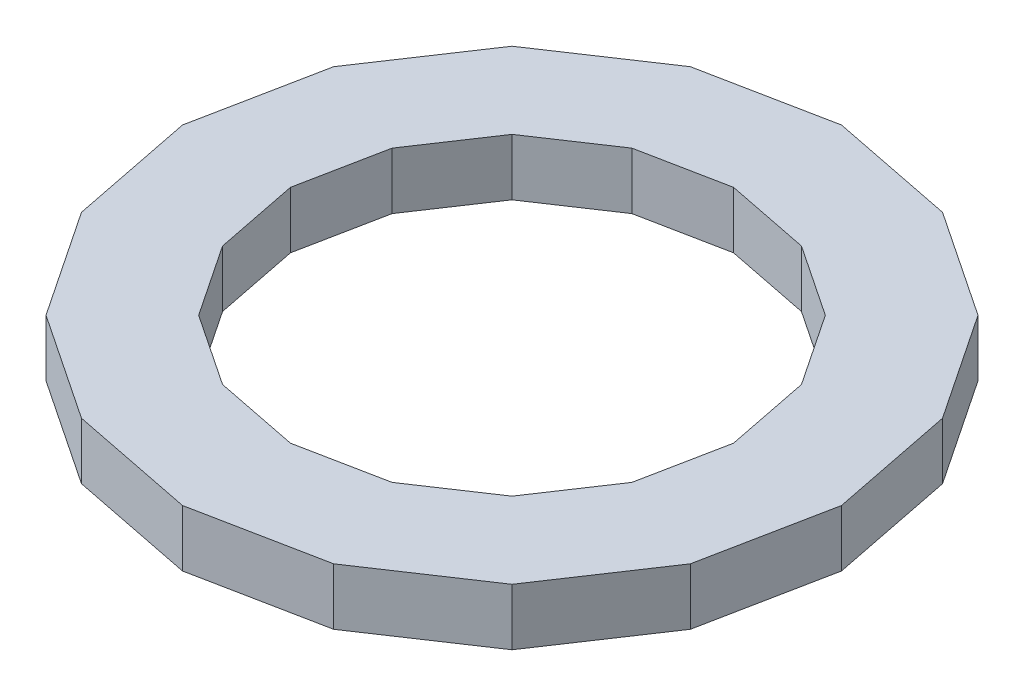
ISO-10303-21;
HEADER;
FILE_DESCRIPTION(('STEP AP214'),'2;1');
FILE_NAME('part.step','',(''),(''),'','','');
FILE_SCHEMA(('AUTOMOTIVE_DESIGN { 1 0 10303 214 1 1 1 1 }'));
ENDSEC;
DATA;
#1=APPLICATION_CONTEXT('core data for automotive mechanical design processes');
#2=APPLICATION_PROTOCOL_DEFINITION('international standard','automotive_design',2000,#1);
#3=PRODUCT_CONTEXT('',#1,'mechanical');
#4=PRODUCT('Part','Part','',(#3));
#5=PRODUCT_RELATED_PRODUCT_CATEGORY('part','',(#4));
#6=PRODUCT_DEFINITION_FORMATION('','',#4);
#7=PRODUCT_DEFINITION_CONTEXT('part definition',#1,'design');
#8=PRODUCT_DEFINITION('design','',#6,#7);
#9=PRODUCT_DEFINITION_SHAPE('','',#8);
#10=(LENGTH_UNIT() NAMED_UNIT(*) SI_UNIT(.MILLI.,.METRE.));
#11=(NAMED_UNIT(*) PLANE_ANGLE_UNIT() SI_UNIT($,.RADIAN.));
#12=(NAMED_UNIT(*) SI_UNIT($,.STERADIAN.) SOLID_ANGLE_UNIT());
#13=UNCERTAINTY_MEASURE_WITH_UNIT(LENGTH_MEASURE(1.E-05),#10,'distance_accuracy_value','');
#14=(GEOMETRIC_REPRESENTATION_CONTEXT(3) GLOBAL_UNCERTAINTY_ASSIGNED_CONTEXT((#13)) GLOBAL_UNIT_ASSIGNED_CONTEXT((#10,
#11,#12)) REPRESENTATION_CONTEXT('',''));
#15=CARTESIAN_POINT('',(0.,0.,0.));
#16=DIRECTION('',(0.,0.,1.));
#17=DIRECTION('',(1.,0.,0.));
#18=AXIS2_PLACEMENT_3D('',#15,#16,#17);
#19=CARTESIAN_POINT('',(0.,19.05,0.));
#20=DIRECTION('',(0.,1.,0.));
#21=DIRECTION('',(0.,0.,1.));
#22=AXIS2_PLACEMENT_3D('',#19,#20,#21);
#23=PLANE('',#22);
#24=DIRECTION('',(0.195090322016116,0.,-0.980785280403233));
#25=VECTOR('',#24,1.);
#26=CARTESIAN_POINT('',(102.242688928822,19.05,42.3503084078103));
#27=LINE('',#26,#25);
#28=CARTESIAN_POINT('',(102.242688928822,19.05,42.3503084078103));
#29=VERTEX_POINT('',#28);
#30=CARTESIAN_POINT('',(110.666689033478,19.05,-1.4953395989219E-12));
#31=VERTEX_POINT('',#30);
#32=EDGE_CURVE('E371',#29,#31,#27,.T.);
#33=ORIENTED_EDGE('',*,*,#32,.T.);
#34=DIRECTION('',(-0.195090322016141,0.,-0.980785280403228));
#35=VECTOR('',#34,1.);
#36=CARTESIAN_POINT('',(110.666689033478,19.05,-1.4953395989219E-12));
#37=LINE('',#36,#35);
#38=CARTESIAN_POINT('',(102.242688928821,19.05,-42.3503084078129));
#39=VERTEX_POINT('',#38);
#40=EDGE_CURVE('E374',#31,#39,#37,.T.);
#41=ORIENTED_EDGE('',*,*,#40,.T.);
#42=DIRECTION('',(-0.555570233019613,0.,-0.831469612302538));
#43=VECTOR('',#42,1.);
#44=CARTESIAN_POINT('',(102.242688928821,19.05,-42.3503084078129));
#45=LINE('',#44,#43);
#46=CARTESIAN_POINT('',(78.2531662670345,19.05,-78.2531662670365));
#47=VERTEX_POINT('',#46);
#48=EDGE_CURVE('E377',#39,#47,#45,.T.);
#49=ORIENTED_EDGE('',*,*,#48,.T.);
#50=DIRECTION('',(-0.831469612302552,0.,-0.555570233019592));
#51=VECTOR('',#50,1.);
#52=CARTESIAN_POINT('',(78.2531662670345,19.05,-78.2531662670365));
#53=LINE('',#52,#51);
#54=CARTESIAN_POINT('',(42.3503084078102,19.05,-102.242688928823));
#55=VERTEX_POINT('',#54);
#56=EDGE_CURVE('E380',#47,#55,#53,.T.);
#57=ORIENTED_EDGE('',*,*,#56,.T.);
#58=DIRECTION('',(-0.980785280403233,0.,-0.195090322016115));
#59=VECTOR('',#58,1.);
#60=CARTESIAN_POINT('',(42.3503084078102,19.05,-102.242688928823));
#61=LINE('',#60,#59);
#62=CARTESIAN_POINT('',(-1.43636586843432E-12,19.05,-110.666689033478));
#63=VERTEX_POINT('',#62);
#64=EDGE_CURVE('E383',#55,#63,#61,.T.);
#65=ORIENTED_EDGE('',*,*,#64,.T.);
#66=DIRECTION('',(-0.980785280403228,0.,0.195090322016141));
#67=VECTOR('',#66,1.);
#68=CARTESIAN_POINT('',(-1.43636586843432E-12,19.05,-110.666689033478));
#69=LINE('',#68,#67);
#70=CARTESIAN_POINT('',(-42.3503084078129,19.05,-102.242688928821));
#71=VERTEX_POINT('',#70);
#72=EDGE_CURVE('E385',#63,#71,#69,.T.);
#73=ORIENTED_EDGE('',*,*,#72,.T.);
#74=DIRECTION('',(-0.831469612302538,0.,0.555570233019613));
#75=VECTOR('',#74,1.);
#76=CARTESIAN_POINT('',(-42.3503084078129,19.05,-102.242688928821));
#77=LINE('',#76,#75);
#78=CARTESIAN_POINT('',(-78.2531662670365,19.05,-78.2531662670345));
#79=VERTEX_POINT('',#78);
#80=EDGE_CURVE('E387',#71,#79,#77,.T.);
#81=ORIENTED_EDGE('',*,*,#80,.T.);
#82=DIRECTION('',(-0.555570233019591,0.,0.831469612302553));
#83=VECTOR('',#82,1.);
#84=CARTESIAN_POINT('',(-78.2531662670365,19.05,-78.2531662670345));
#85=LINE('',#84,#83);
#86=CARTESIAN_POINT('',(-102.242688928823,19.05,-42.3503084078103));
#87=VERTEX_POINT('',#86);
#88=EDGE_CURVE('E389',#79,#87,#85,.T.);
#89=ORIENTED_EDGE('',*,*,#88,.T.);
#90=DIRECTION('',(-0.195090322016116,0.,0.980785280403233));
#91=VECTOR('',#90,1.);
#92=CARTESIAN_POINT('',(-102.242688928823,19.05,-42.3503084078103));
#93=LINE('',#92,#91);
#94=CARTESIAN_POINT('',(-110.666689033478,19.05,1.40870573008105E-12));
#95=VERTEX_POINT('',#94);
#96=EDGE_CURVE('E391',#87,#95,#93,.T.);
#97=ORIENTED_EDGE('',*,*,#96,.T.);
#98=DIRECTION('',(0.195090322016141,0.,0.980785280403228));
#99=VECTOR('',#98,1.);
#100=CARTESIAN_POINT('',(-110.666689033478,19.05,1.40870573008105E-12));
#101=LINE('',#100,#99);
#102=CARTESIAN_POINT('',(-102.242688928821,19.05,42.3503084078128));
#103=VERTEX_POINT('',#102);
#104=EDGE_CURVE('E393',#95,#103,#101,.T.);
#105=ORIENTED_EDGE('',*,*,#104,.T.);
#106=DIRECTION('',(0.555570233019613,0.,0.831469612302538));
#107=VECTOR('',#106,1.);
#108=CARTESIAN_POINT('',(-102.242688928821,19.05,42.3503084078128));
#109=LINE('',#108,#107);
#110=CARTESIAN_POINT('',(-78.2531662670345,19.05,78.2531662670365));
#111=VERTEX_POINT('',#110);
#112=EDGE_CURVE('E395',#103,#111,#109,.T.);
#113=ORIENTED_EDGE('',*,*,#112,.T.);
#114=DIRECTION('',(0.831469612302552,0.,0.555570233019591));
#115=VECTOR('',#114,1.);
#116=CARTESIAN_POINT('',(-78.2531662670345,19.05,78.2531662670365));
#117=LINE('',#116,#115);
#118=CARTESIAN_POINT('',(-42.3503084078102,19.05,102.242688928823));
#119=VERTEX_POINT('',#118);
#120=EDGE_CURVE('E397',#111,#119,#117,.T.);
#121=ORIENTED_EDGE('',*,*,#120,.T.);
#122=DIRECTION('',(0.980785280403233,0.,0.195090322016116));
#123=VECTOR('',#122,1.);
#124=CARTESIAN_POINT('',(-42.3503084078102,19.05,102.242688928823));
#125=LINE('',#124,#123);
#126=CARTESIAN_POINT('',(1.40715860597392E-12,19.05,110.666689033478));
#127=VERTEX_POINT('',#126);
#128=EDGE_CURVE('E399',#119,#127,#125,.T.);
#129=ORIENTED_EDGE('',*,*,#128,.T.);
#130=DIRECTION('',(0.980785280403228,0.,-0.195090322016141));
#131=VECTOR('',#130,1.);
#132=CARTESIAN_POINT('',(1.40715860597392E-12,19.05,110.666689033478));
#133=LINE('',#132,#131);
#134=CARTESIAN_POINT('',(42.3503084078129,19.05,102.242688928821));
#135=VERTEX_POINT('',#134);
#136=EDGE_CURVE('E401',#127,#135,#133,.T.);
#137=ORIENTED_EDGE('',*,*,#136,.T.);
#138=DIRECTION('',(0.831469612302538,0.,-0.555570233019613));
#139=VECTOR('',#138,1.);
#140=CARTESIAN_POINT('',(42.3503084078129,19.05,102.242688928821));
#141=LINE('',#140,#139);
#142=CARTESIAN_POINT('',(78.2531662670365,19.05,78.2531662670345));
#143=VERTEX_POINT('',#142);
#144=EDGE_CURVE('E403',#135,#143,#141,.T.);
#145=ORIENTED_EDGE('',*,*,#144,.T.);
#146=DIRECTION('',(0.555570233019592,0.,-0.831469612302552));
#147=VECTOR('',#146,1.);
#148=CARTESIAN_POINT('',(78.2531662670365,19.05,78.2531662670345));
#149=LINE('',#148,#147);
#150=EDGE_CURVE('E405',#143,#29,#149,.T.);
#151=ORIENTED_EDGE('',*,*,#150,.T.);
#152=EDGE_LOOP('',(#33,#41,#49,#57,#65,#73,#81,#89,#97,#105,#113,#121,#129,#137,#145,#151));
#153=FACE_BOUND('',#152,.T.);
#154=DIRECTION('',(-0.195090322016141,0.,-0.980785280403228));
#155=VECTOR('',#154,1.);
#156=CARTESIAN_POINT('',(74.4100274475906,19.05,-1.033825164011E-12));
#157=LINE('',#156,#155);
#158=CARTESIAN_POINT('',(74.4100274475906,19.05,-1.033825164011E-12));
#159=VERTEX_POINT('',#158);
#160=CARTESIAN_POINT('',(68.7459013724316,19.05,-28.4754847060254));
#161=VERTEX_POINT('',#160);
#162=EDGE_CURVE('E252',#159,#161,#157,.T.);
#163=ORIENTED_EDGE('',*,*,#162,.F.);
#164=DIRECTION('',(0.195090322016116,0.,-0.980785280403233));
#165=VECTOR('',#164,1.);
#166=CARTESIAN_POINT('',(68.7459013724324,19.05,28.4754847060236));
#167=LINE('',#166,#165);
#168=CARTESIAN_POINT('',(68.7459013724324,19.05,28.4754847060236));
#169=VERTEX_POINT('',#168);
#170=EDGE_CURVE('E244',#169,#159,#167,.T.);
#171=ORIENTED_EDGE('',*,*,#170,.F.);
#172=DIRECTION('',(0.555570233019591,0.,-0.831469612302553));
#173=VECTOR('',#172,1.);
#174=CARTESIAN_POINT('',(52.6158349964691,19.05,52.6158349964677));
#175=LINE('',#174,#173);
#176=CARTESIAN_POINT('',(52.6158349964691,19.05,52.6158349964677));
#177=VERTEX_POINT('',#176);
#178=EDGE_CURVE('E297',#177,#169,#175,.T.);
#179=ORIENTED_EDGE('',*,*,#178,.F.);
#180=DIRECTION('',(0.831469612302538,0.,-0.555570233019613));
#181=VECTOR('',#180,1.);
#182=CARTESIAN_POINT('',(28.4754847060254,19.05,68.7459013724316));
#183=LINE('',#182,#181);
#184=CARTESIAN_POINT('',(28.4754847060254,19.05,68.7459013724316));
#185=VERTEX_POINT('',#184);
#186=EDGE_CURVE('E295',#185,#177,#183,.T.);
#187=ORIENTED_EDGE('',*,*,#186,.F.);
#188=DIRECTION('',(0.980785280403228,0.,-0.195090322016141));
#189=VECTOR('',#188,1.);
#190=CARTESIAN_POINT('',(9.26973540631694E-13,19.05,74.4100274475906));
#191=LINE('',#190,#189);
#192=CARTESIAN_POINT('',(9.26973540631694E-13,19.05,74.4100274475906));
#193=VERTEX_POINT('',#192);
#194=EDGE_CURVE('E293',#193,#185,#191,.T.);
#195=ORIENTED_EDGE('',*,*,#194,.F.);
#196=DIRECTION('',(0.980785280403233,0.,0.195090322016116));
#197=VECTOR('',#196,1.);
#198=CARTESIAN_POINT('',(-28.4754847060236,19.05,68.7459013724324));
#199=LINE('',#198,#197);
#200=CARTESIAN_POINT('',(-28.4754847060236,19.05,68.7459013724324));
#201=VERTEX_POINT('',#200);
#202=EDGE_CURVE('E291',#201,#193,#199,.T.);
#203=ORIENTED_EDGE('',*,*,#202,.F.);
#204=DIRECTION('',(0.831469612302553,0.,0.555570233019591));
#205=VECTOR('',#204,1.);
#206=CARTESIAN_POINT('',(-52.6158349964677,19.05,52.6158349964691));
#207=LINE('',#206,#205);
#208=CARTESIAN_POINT('',(-52.6158349964677,19.05,52.6158349964691));
#209=VERTEX_POINT('',#208);
#210=EDGE_CURVE('E289',#209,#201,#207,.T.);
#211=ORIENTED_EDGE('',*,*,#210,.F.);
#212=DIRECTION('',(0.555570233019613,0.,0.831469612302538));
#213=VECTOR('',#212,1.);
#214=CARTESIAN_POINT('',(-68.7459013724316,19.05,28.4754847060254));
#215=LINE('',#214,#213);
#216=CARTESIAN_POINT('',(-68.7459013724316,19.05,28.4754847060254));
#217=VERTEX_POINT('',#216);
#218=EDGE_CURVE('E286',#217,#209,#215,.T.);
#219=ORIENTED_EDGE('',*,*,#218,.F.);
#220=DIRECTION('',(0.195090322016141,0.,0.980785280403228));
#221=VECTOR('',#220,1.);
#222=CARTESIAN_POINT('',(-74.4100274475906,19.05,9.43546469602868E-13));
#223=LINE('',#222,#221);
#224=CARTESIAN_POINT('',(-74.4100274475906,19.05,9.43546469602868E-13));
#225=VERTEX_POINT('',#224);
#226=EDGE_CURVE('E284',#225,#217,#223,.T.);
#227=ORIENTED_EDGE('',*,*,#226,.F.);
#228=DIRECTION('',(-0.195090322016116,0.,0.980785280403233));
#229=VECTOR('',#228,1.);
#230=CARTESIAN_POINT('',(-68.7459013724324,19.05,-28.4754847060236));
#231=LINE('',#230,#229);
#232=CARTESIAN_POINT('',(-68.7459013724324,19.05,-28.4754847060236));
#233=VERTEX_POINT('',#232);
#234=EDGE_CURVE('E281',#233,#225,#231,.T.);
#235=ORIENTED_EDGE('',*,*,#234,.F.);
#236=DIRECTION('',(-0.555570233019591,0.,0.831469612302553));
#237=VECTOR('',#236,1.);
#238=CARTESIAN_POINT('',(-52.6158349964691,19.05,-52.6158349964678));
#239=LINE('',#238,#237);
#240=CARTESIAN_POINT('',(-52.6158349964691,19.05,-52.6158349964678));
#241=VERTEX_POINT('',#240);
#242=EDGE_CURVE('E279',#241,#233,#239,.T.);
#243=ORIENTED_EDGE('',*,*,#242,.F.);
#244=DIRECTION('',(-0.831469612302538,0.,0.555570233019613));
#245=VECTOR('',#244,1.);
#246=CARTESIAN_POINT('',(-28.4754847060254,19.05,-68.7459013724316));
#247=LINE('',#246,#245);
#248=CARTESIAN_POINT('',(-28.4754847060254,19.05,-68.7459013724316));
#249=VERTEX_POINT('',#248);
#250=EDGE_CURVE('E277',#249,#241,#247,.T.);
#251=ORIENTED_EDGE('',*,*,#250,.F.);
#252=DIRECTION('',(-0.980785280403228,0.,0.195090322016141));
#253=VECTOR('',#252,1.);
#254=CARTESIAN_POINT('',(-1.0063858100745E-12,19.05,-74.4100274475906));
#255=LINE('',#254,#253);
#256=CARTESIAN_POINT('',(-1.0063858100745E-12,19.05,-74.4100274475906));
#257=VERTEX_POINT('',#256);
#258=EDGE_CURVE('E275',#257,#249,#255,.T.);
#259=ORIENTED_EDGE('',*,*,#258,.F.);
#260=DIRECTION('',(-0.980785280403233,0.,-0.195090322016115));
#261=VECTOR('',#260,1.);
#262=CARTESIAN_POINT('',(28.4754847060237,19.05,-68.7459013724323));
#263=LINE('',#262,#261);
#264=CARTESIAN_POINT('',(28.4754847060237,19.05,-68.7459013724323));
#265=VERTEX_POINT('',#264);
#266=EDGE_CURVE('E272',#265,#257,#263,.T.);
#267=ORIENTED_EDGE('',*,*,#266,.F.);
#268=DIRECTION('',(-0.831469612302553,0.,-0.555570233019591));
#269=VECTOR('',#268,1.);
#270=CARTESIAN_POINT('',(52.6158349964677,19.05,-52.6158349964692));
#271=LINE('',#270,#269);
#272=CARTESIAN_POINT('',(52.6158349964677,19.05,-52.6158349964692));
#273=VERTEX_POINT('',#272);
#274=EDGE_CURVE('E267',#273,#265,#271,.T.);
#275=ORIENTED_EDGE('',*,*,#274,.F.);
#276=DIRECTION('',(-0.555570233019613,0.,-0.831469612302538));
#277=VECTOR('',#276,1.);
#278=CARTESIAN_POINT('',(68.7459013724316,19.05,-28.4754847060254));
#279=LINE('',#278,#277);
#280=EDGE_CURVE('E265',#161,#273,#279,.T.);
#281=ORIENTED_EDGE('',*,*,#280,.F.);
#282=EDGE_LOOP('',(#163,#171,#179,#187,#195,#203,#211,#219,#227,#235,#243,#251,#259,#267,#275,#281));
#283=FACE_BOUND('',#282,.T.);
#284=ADVANCED_FACE('F35',(#153,#283),#23,.T.);
#285=CARTESIAN_POINT('',(0.,0.,0.));
#286=DIRECTION('',(0.,1.,0.));
#287=DIRECTION('',(0.,0.,1.));
#288=AXIS2_PLACEMENT_3D('',#285,#286,#287);
#289=PLANE('',#288);
#290=DIRECTION('',(0.195090322016116,0.,-0.980785280403233));
#291=VECTOR('',#290,1.);
#292=CARTESIAN_POINT('',(102.242688928822,0.,42.3503084078103));
#293=LINE('',#292,#291);
#294=CARTESIAN_POINT('',(102.242688928822,0.,42.3503084078103));
#295=VERTEX_POINT('',#294);
#296=CARTESIAN_POINT('',(110.666689033478,0.,-1.4953395989219E-12));
#297=VERTEX_POINT('',#296);
#298=EDGE_CURVE('E260',#295,#297,#293,.T.);
#299=ORIENTED_EDGE('',*,*,#298,.F.);
#300=DIRECTION('',(0.555570233019592,0.,-0.831469612302552));
#301=VECTOR('',#300,1.);
#302=CARTESIAN_POINT('',(78.2531662670365,0.,78.2531662670345));
#303=LINE('',#302,#301);
#304=CARTESIAN_POINT('',(78.2531662670365,0.,78.2531662670345));
#305=VERTEX_POINT('',#304);
#306=EDGE_CURVE('E375',#305,#295,#303,.T.);
#307=ORIENTED_EDGE('',*,*,#306,.F.);
#308=DIRECTION('',(0.831469612302538,0.,-0.555570233019613));
#309=VECTOR('',#308,1.);
#310=CARTESIAN_POINT('',(42.3503084078129,0.,102.242688928821));
#311=LINE('',#310,#309);
#312=CARTESIAN_POINT('',(42.3503084078129,0.,102.242688928821));
#313=VERTEX_POINT('',#312);
#314=EDGE_CURVE('E438',#313,#305,#311,.T.);
#315=ORIENTED_EDGE('',*,*,#314,.F.);
#316=DIRECTION('',(0.980785280403228,0.,-0.195090322016141));
#317=VECTOR('',#316,1.);
#318=CARTESIAN_POINT('',(1.40715860597392E-12,0.,110.666689033478));
#319=LINE('',#318,#317);
#320=CARTESIAN_POINT('',(1.40715860597392E-12,0.,110.666689033478));
#321=VERTEX_POINT('',#320);
#322=EDGE_CURVE('E436',#321,#313,#319,.T.);
#323=ORIENTED_EDGE('',*,*,#322,.F.);
#324=DIRECTION('',(0.980785280403233,0.,0.195090322016116));
#325=VECTOR('',#324,1.);
#326=CARTESIAN_POINT('',(-42.3503084078102,0.,102.242688928823));
#327=LINE('',#326,#325);
#328=CARTESIAN_POINT('',(-42.3503084078102,0.,102.242688928823));
#329=VERTEX_POINT('',#328);
#330=EDGE_CURVE('E434',#329,#321,#327,.T.);
#331=ORIENTED_EDGE('',*,*,#330,.F.);
#332=DIRECTION('',(0.831469612302552,0.,0.555570233019591));
#333=VECTOR('',#332,1.);
#334=CARTESIAN_POINT('',(-78.2531662670345,0.,78.2531662670365));
#335=LINE('',#334,#333);
#336=CARTESIAN_POINT('',(-78.2531662670345,0.,78.2531662670365));
#337=VERTEX_POINT('',#336);
#338=EDGE_CURVE('E432',#337,#329,#335,.T.);
#339=ORIENTED_EDGE('',*,*,#338,.F.);
#340=DIRECTION('',(0.555570233019613,0.,0.831469612302538));
#341=VECTOR('',#340,1.);
#342=CARTESIAN_POINT('',(-102.242688928821,0.,42.3503084078128));
#343=LINE('',#342,#341);
#344=CARTESIAN_POINT('',(-102.242688928821,0.,42.3503084078128));
#345=VERTEX_POINT('',#344);
#346=EDGE_CURVE('E430',#345,#337,#343,.T.);
#347=ORIENTED_EDGE('',*,*,#346,.F.);
#348=DIRECTION('',(0.195090322016141,0.,0.980785280403228));
#349=VECTOR('',#348,1.);
#350=CARTESIAN_POINT('',(-110.666689033478,0.,1.40870573008105E-12));
#351=LINE('',#350,#349);
#352=CARTESIAN_POINT('',(-110.666689033478,0.,1.40870573008105E-12));
#353=VERTEX_POINT('',#352);
#354=EDGE_CURVE('E428',#353,#345,#351,.T.);
#355=ORIENTED_EDGE('',*,*,#354,.F.);
#356=DIRECTION('',(-0.195090322016116,0.,0.980785280403233));
#357=VECTOR('',#356,1.);
#358=CARTESIAN_POINT('',(-102.242688928823,0.,-42.3503084078103));
#359=LINE('',#358,#357);
#360=CARTESIAN_POINT('',(-102.242688928823,0.,-42.3503084078103));
#361=VERTEX_POINT('',#360);
#362=EDGE_CURVE('E426',#361,#353,#359,.T.);
#363=ORIENTED_EDGE('',*,*,#362,.F.);
#364=DIRECTION('',(-0.555570233019591,0.,0.831469612302553));
#365=VECTOR('',#364,1.);
#366=CARTESIAN_POINT('',(-78.2531662670365,0.,-78.2531662670345));
#367=LINE('',#366,#365);
#368=CARTESIAN_POINT('',(-78.2531662670365,0.,-78.2531662670345));
#369=VERTEX_POINT('',#368);
#370=EDGE_CURVE('E424',#369,#361,#367,.T.);
#371=ORIENTED_EDGE('',*,*,#370,.F.);
#372=DIRECTION('',(-0.831469612302538,0.,0.555570233019613));
#373=VECTOR('',#372,1.);
#374=CARTESIAN_POINT('',(-42.3503084078129,0.,-102.242688928821));
#375=LINE('',#374,#373);
#376=CARTESIAN_POINT('',(-42.3503084078129,0.,-102.242688928821));
#377=VERTEX_POINT('',#376);
#378=EDGE_CURVE('E421',#377,#369,#375,.T.);
#379=ORIENTED_EDGE('',*,*,#378,.F.);
#380=DIRECTION('',(-0.980785280403228,0.,0.195090322016141));
#381=VECTOR('',#380,1.);
#382=CARTESIAN_POINT('',(-1.43636586843432E-12,0.,-110.666689033478));
#383=LINE('',#382,#381);
#384=CARTESIAN_POINT('',(-1.43636586843432E-12,0.,-110.666689033478));
#385=VERTEX_POINT('',#384);
#386=EDGE_CURVE('E419',#385,#377,#383,.T.);
#387=ORIENTED_EDGE('',*,*,#386,.F.);
#388=DIRECTION('',(-0.980785280403233,0.,-0.195090322016115));
#389=VECTOR('',#388,1.);
#390=CARTESIAN_POINT('',(42.3503084078102,0.,-102.242688928823));
#391=LINE('',#390,#389);
#392=CARTESIAN_POINT('',(42.3503084078102,0.,-102.242688928823));
#393=VERTEX_POINT('',#392);
#394=EDGE_CURVE('E417',#393,#385,#391,.T.);
#395=ORIENTED_EDGE('',*,*,#394,.F.);
#396=DIRECTION('',(-0.831469612302552,0.,-0.555570233019592));
#397=VECTOR('',#396,1.);
#398=CARTESIAN_POINT('',(78.2531662670345,0.,-78.2531662670365));
#399=LINE('',#398,#397);
#400=CARTESIAN_POINT('',(78.2531662670345,0.,-78.2531662670365));
#401=VERTEX_POINT('',#400);
#402=EDGE_CURVE('E414',#401,#393,#399,.T.);
#403=ORIENTED_EDGE('',*,*,#402,.F.);
#404=DIRECTION('',(-0.555570233019613,0.,-0.831469612302538));
#405=VECTOR('',#404,1.);
#406=CARTESIAN_POINT('',(102.242688928821,0.,-42.3503084078129));
#407=LINE('',#406,#405);
#408=CARTESIAN_POINT('',(102.242688928821,0.,-42.3503084078129));
#409=VERTEX_POINT('',#408);
#410=EDGE_CURVE('E412',#409,#401,#407,.T.);
#411=ORIENTED_EDGE('',*,*,#410,.F.);
#412=DIRECTION('',(-0.195090322016141,0.,-0.980785280403228));
#413=VECTOR('',#412,1.);
#414=CARTESIAN_POINT('',(110.666689033478,0.,-1.4953395989219E-12));
#415=LINE('',#414,#413);
#416=EDGE_CURVE('E410',#297,#409,#415,.T.);
#417=ORIENTED_EDGE('',*,*,#416,.F.);
#418=EDGE_LOOP('',(#299,#307,#315,#323,#331,#339,#347,#355,#363,#371,#379,#387,#395,#403,#411,#417));
#419=FACE_BOUND('',#418,.T.);
#420=DIRECTION('',(0.195090322016116,0.,-0.980785280403233));
#421=VECTOR('',#420,1.);
#422=CARTESIAN_POINT('',(68.7459013724324,0.,28.4754847060236));
#423=LINE('',#422,#421);
#424=CARTESIAN_POINT('',(68.7459013724324,0.,28.4754847060236));
#425=VERTEX_POINT('',#424);
#426=CARTESIAN_POINT('',(74.4100274475906,0.,-1.033825164011E-12));
#427=VERTEX_POINT('',#426);
#428=EDGE_CURVE('E58',#425,#427,#423,.T.);
#429=ORIENTED_EDGE('',*,*,#428,.T.);
#430=DIRECTION('',(-0.195090322016141,0.,-0.980785280403228));
#431=VECTOR('',#430,1.);
#432=CARTESIAN_POINT('',(74.4100274475906,0.,-1.033825164011E-12));
#433=LINE('',#432,#431);
#434=CARTESIAN_POINT('',(68.7459013724316,0.,-28.4754847060254));
#435=VERTEX_POINT('',#434);
#436=EDGE_CURVE('E259',#427,#435,#433,.T.);
#437=ORIENTED_EDGE('',*,*,#436,.T.);
#438=DIRECTION('',(-0.555570233019613,0.,-0.831469612302538));
#439=VECTOR('',#438,1.);
#440=CARTESIAN_POINT('',(68.7459013724316,0.,-28.4754847060254));
#441=LINE('',#440,#439);
#442=CARTESIAN_POINT('',(52.6158349964677,0.,-52.6158349964692));
#443=VERTEX_POINT('',#442);
#444=EDGE_CURVE('E302',#435,#443,#441,.T.);
#445=ORIENTED_EDGE('',*,*,#444,.T.);
#446=DIRECTION('',(-0.831469612302553,0.,-0.555570233019591));
#447=VECTOR('',#446,1.);
#448=CARTESIAN_POINT('',(52.6158349964677,0.,-52.6158349964692));
#449=LINE('',#448,#447);
#450=CARTESIAN_POINT('',(28.4754847060237,0.,-68.7459013724323));
#451=VERTEX_POINT('',#450);
#452=EDGE_CURVE('E305',#443,#451,#449,.T.);
#453=ORIENTED_EDGE('',*,*,#452,.T.);
#454=DIRECTION('',(-0.980785280403233,0.,-0.195090322016115));
#455=VECTOR('',#454,1.);
#456=CARTESIAN_POINT('',(28.4754847060237,0.,-68.7459013724323));
#457=LINE('',#456,#455);
#458=CARTESIAN_POINT('',(-1.0063858100745E-12,0.,-74.4100274475906));
#459=VERTEX_POINT('',#458);
#460=EDGE_CURVE('E308',#451,#459,#457,.T.);
#461=ORIENTED_EDGE('',*,*,#460,.T.);
#462=DIRECTION('',(-0.980785280403228,0.,0.195090322016141));
#463=VECTOR('',#462,1.);
#464=CARTESIAN_POINT('',(-1.0063858100745E-12,0.,-74.4100274475906));
#465=LINE('',#464,#463);
#466=CARTESIAN_POINT('',(-28.4754847060254,0.,-68.7459013724316));
#467=VERTEX_POINT('',#466);
#468=EDGE_CURVE('E311',#459,#467,#465,.T.);
#469=ORIENTED_EDGE('',*,*,#468,.T.);
#470=DIRECTION('',(-0.831469612302538,0.,0.555570233019613));
#471=VECTOR('',#470,1.);
#472=CARTESIAN_POINT('',(-28.4754847060254,0.,-68.7459013724316));
#473=LINE('',#472,#471);
#474=CARTESIAN_POINT('',(-52.6158349964691,0.,-52.6158349964678));
#475=VERTEX_POINT('',#474);
#476=EDGE_CURVE('E314',#467,#475,#473,.T.);
#477=ORIENTED_EDGE('',*,*,#476,.T.);
#478=DIRECTION('',(-0.555570233019591,0.,0.831469612302553));
#479=VECTOR('',#478,1.);
#480=CARTESIAN_POINT('',(-52.6158349964691,0.,-52.6158349964678));
#481=LINE('',#480,#479);
#482=CARTESIAN_POINT('',(-68.7459013724324,0.,-28.4754847060236));
#483=VERTEX_POINT('',#482);
#484=EDGE_CURVE('E318',#475,#483,#481,.T.);
#485=ORIENTED_EDGE('',*,*,#484,.T.);
#486=DIRECTION('',(-0.195090322016116,0.,0.980785280403233));
#487=VECTOR('',#486,1.);
#488=CARTESIAN_POINT('',(-68.7459013724324,0.,-28.4754847060236));
#489=LINE('',#488,#487);
#490=CARTESIAN_POINT('',(-74.4100274475906,0.,9.43546469602868E-13));
#491=VERTEX_POINT('',#490);
#492=EDGE_CURVE('E321',#483,#491,#489,.T.);
#493=ORIENTED_EDGE('',*,*,#492,.T.);
#494=DIRECTION('',(0.195090322016141,0.,0.980785280403228));
#495=VECTOR('',#494,1.);
#496=CARTESIAN_POINT('',(-74.4100274475906,0.,9.43546469602868E-13));
#497=LINE('',#496,#495);
#498=CARTESIAN_POINT('',(-68.7459013724316,0.,28.4754847060254));
#499=VERTEX_POINT('',#498);
#500=EDGE_CURVE('E324',#491,#499,#497,.T.);
#501=ORIENTED_EDGE('',*,*,#500,.T.);
#502=DIRECTION('',(0.555570233019613,0.,0.831469612302538));
#503=VECTOR('',#502,1.);
#504=CARTESIAN_POINT('',(-68.7459013724316,0.,28.4754847060254));
#505=LINE('',#504,#503);
#506=CARTESIAN_POINT('',(-52.6158349964677,0.,52.6158349964691));
#507=VERTEX_POINT('',#506);
#508=EDGE_CURVE('E327',#499,#507,#505,.T.);
#509=ORIENTED_EDGE('',*,*,#508,.T.);
#510=DIRECTION('',(0.831469612302553,0.,0.555570233019591));
#511=VECTOR('',#510,1.);
#512=CARTESIAN_POINT('',(-52.6158349964677,0.,52.6158349964691));
#513=LINE('',#512,#511);
#514=CARTESIAN_POINT('',(-28.4754847060236,0.,68.7459013724324));
#515=VERTEX_POINT('',#514);
#516=EDGE_CURVE('E330',#507,#515,#513,.T.);
#517=ORIENTED_EDGE('',*,*,#516,.T.);
#518=DIRECTION('',(0.980785280403233,0.,0.195090322016116));
#519=VECTOR('',#518,1.);
#520=CARTESIAN_POINT('',(-28.4754847060236,0.,68.7459013724324));
#521=LINE('',#520,#519);
#522=CARTESIAN_POINT('',(9.26973540631694E-13,0.,74.4100274475906));
#523=VERTEX_POINT('',#522);
#524=EDGE_CURVE('E333',#515,#523,#521,.T.);
#525=ORIENTED_EDGE('',*,*,#524,.T.);
#526=DIRECTION('',(0.980785280403228,0.,-0.195090322016141));
#527=VECTOR('',#526,1.);
#528=CARTESIAN_POINT('',(9.26973540631694E-13,0.,74.4100274475906));
#529=LINE('',#528,#527);
#530=CARTESIAN_POINT('',(28.4754847060254,0.,68.7459013724316));
#531=VERTEX_POINT('',#530);
#532=EDGE_CURVE('E336',#523,#531,#529,.T.);
#533=ORIENTED_EDGE('',*,*,#532,.T.);
#534=DIRECTION('',(0.831469612302538,0.,-0.555570233019613));
#535=VECTOR('',#534,1.);
#536=CARTESIAN_POINT('',(28.4754847060254,0.,68.7459013724316));
#537=LINE('',#536,#535);
#538=CARTESIAN_POINT('',(52.6158349964691,0.,52.6158349964677));
#539=VERTEX_POINT('',#538);
#540=EDGE_CURVE('E339',#531,#539,#537,.T.);
#541=ORIENTED_EDGE('',*,*,#540,.T.);
#542=DIRECTION('',(0.555570233019591,0.,-0.831469612302553));
#543=VECTOR('',#542,1.);
#544=CARTESIAN_POINT('',(52.6158349964691,0.,52.6158349964677));
#545=LINE('',#544,#543);
#546=EDGE_CURVE('E253',#539,#425,#545,.T.);
#547=ORIENTED_EDGE('',*,*,#546,.T.);
#548=EDGE_LOOP('',(#429,#437,#445,#453,#461,#469,#477,#485,#493,#501,#509,#517,#525,#533,#541,#547));
#549=FACE_BOUND('',#548,.T.);
#550=ADVANCED_FACE('F493',(#419,#549),#289,.F.);
#551=CARTESIAN_POINT('',(102.242688928822,19.05,42.3503084078103));
#552=DIRECTION('',(-0.980785280403233,0.,-0.195090322016116));
#553=DIRECTION('',(-0.195090322016116,0.,0.980785280403233));
#554=AXIS2_PLACEMENT_3D('',#551,#552,#553);
#555=PLANE('',#554);
#556=ORIENTED_EDGE('',*,*,#298,.T.);
#557=DIRECTION('',(0.,-1.,0.));
#558=VECTOR('',#557,1.);
#559=CARTESIAN_POINT('',(110.666689033478,19.05,-1.4953395989219E-12));
#560=LINE('',#559,#558);
#561=EDGE_CURVE('E11',#31,#297,#560,.T.);
#562=ORIENTED_EDGE('',*,*,#561,.F.);
#563=ORIENTED_EDGE('',*,*,#32,.F.);
#564=DIRECTION('',(0.,-1.,0.));
#565=VECTOR('',#564,1.);
#566=CARTESIAN_POINT('',(102.242688928822,19.05,42.3503084078103));
#567=LINE('',#566,#565);
#568=EDGE_CURVE('E407',#29,#295,#567,.T.);
#569=ORIENTED_EDGE('',*,*,#568,.T.);
#570=EDGE_LOOP('',(#556,#562,#563,#569));
#571=FACE_BOUND('',#570,.T.);
#572=ADVANCED_FACE('F37',(#571),#555,.F.);
#573=CARTESIAN_POINT('',(110.666689033478,19.05,-1.4953395989219E-12));
#574=DIRECTION('',(-0.980785280403228,0.,0.195090322016141));
#575=DIRECTION('',(0.195090322016141,0.,0.980785280403228));
#576=AXIS2_PLACEMENT_3D('',#573,#574,#575);
#577=PLANE('',#576);
#578=ORIENTED_EDGE('',*,*,#416,.T.);
#579=DIRECTION('',(0.,-1.,0.));
#580=VECTOR('',#579,1.);
#581=CARTESIAN_POINT('',(102.242688928821,19.05,-42.3503084078129));
#582=LINE('',#581,#580);
#583=EDGE_CURVE('E43',#39,#409,#582,.T.);
#584=ORIENTED_EDGE('',*,*,#583,.F.);
#585=ORIENTED_EDGE('',*,*,#40,.F.);
#586=ORIENTED_EDGE('',*,*,#561,.T.);
#587=EDGE_LOOP('',(#578,#584,#585,#586));
#588=FACE_BOUND('',#587,.T.);
#589=ADVANCED_FACE('F510',(#588),#577,.F.);
#590=CARTESIAN_POINT('',(102.242688928821,19.05,-42.3503084078129));
#591=DIRECTION('',(-0.831469612302538,0.,0.555570233019613));
#592=DIRECTION('',(0.555570233019613,0.,0.831469612302538));
#593=AXIS2_PLACEMENT_3D('',#590,#591,#592);
#594=PLANE('',#593);
#595=ORIENTED_EDGE('',*,*,#410,.T.);
#596=DIRECTION('',(0.,-1.,0.));
#597=VECTOR('',#596,1.);
#598=CARTESIAN_POINT('',(78.2531662670345,19.05,-78.2531662670365));
#599=LINE('',#598,#597);
#600=EDGE_CURVE('E480',#47,#401,#599,.T.);
#601=ORIENTED_EDGE('',*,*,#600,.F.);
#602=ORIENTED_EDGE('',*,*,#48,.F.);
#603=ORIENTED_EDGE('',*,*,#583,.T.);
#604=EDGE_LOOP('',(#595,#601,#602,#603));
#605=FACE_BOUND('',#604,.T.);
#606=ADVANCED_FACE('F487',(#605),#594,.F.);
#607=CARTESIAN_POINT('',(78.2531662670345,19.05,-78.2531662670365));
#608=DIRECTION('',(-0.555570233019592,0.,0.831469612302552));
#609=DIRECTION('',(0.831469612302553,0.,0.555570233019592));
#610=AXIS2_PLACEMENT_3D('',#607,#608,#609);
#611=PLANE('',#610);
#612=ORIENTED_EDGE('',*,*,#402,.T.);
#613=DIRECTION('',(0.,-1.,0.));
#614=VECTOR('',#613,1.);
#615=CARTESIAN_POINT('',(42.3503084078102,19.05,-102.242688928823));
#616=LINE('',#615,#614);
#617=EDGE_CURVE('E476',#55,#393,#616,.T.);
#618=ORIENTED_EDGE('',*,*,#617,.F.);
#619=ORIENTED_EDGE('',*,*,#56,.F.);
#620=ORIENTED_EDGE('',*,*,#600,.T.);
#621=EDGE_LOOP('',(#612,#618,#619,#620));
#622=FACE_BOUND('',#621,.T.);
#623=ADVANCED_FACE('F499',(#622),#611,.F.);
#624=CARTESIAN_POINT('',(42.3503084078102,19.05,-102.242688928823));
#625=DIRECTION('',(-0.195090322016115,0.,0.980785280403233));
#626=DIRECTION('',(0.980785280403233,0.,0.195090322016115));
#627=AXIS2_PLACEMENT_3D('',#624,#625,#626);
#628=PLANE('',#627);
#629=ORIENTED_EDGE('',*,*,#394,.T.);
#630=DIRECTION('',(0.,-1.,0.));
#631=VECTOR('',#630,1.);
#632=CARTESIAN_POINT('',(-1.43636586843432E-12,19.05,-110.666689033478));
#633=LINE('',#632,#631);
#634=EDGE_CURVE('E473',#63,#385,#633,.T.);
#635=ORIENTED_EDGE('',*,*,#634,.F.);
#636=ORIENTED_EDGE('',*,*,#64,.F.);
#637=ORIENTED_EDGE('',*,*,#617,.T.);
#638=EDGE_LOOP('',(#629,#635,#636,#637));
#639=FACE_BOUND('',#638,.T.);
#640=ADVANCED_FACE('F503',(#639),#628,.F.);
#641=CARTESIAN_POINT('',(-1.43636586843432E-12,19.05,-110.666689033478));
#642=DIRECTION('',(0.195090322016141,0.,0.980785280403228));
#643=DIRECTION('',(0.980785280403228,0.,-0.195090322016141));
#644=AXIS2_PLACEMENT_3D('',#641,#642,#643);
#645=PLANE('',#644);
#646=ORIENTED_EDGE('',*,*,#386,.T.);
#647=DIRECTION('',(0.,-1.,0.));
#648=VECTOR('',#647,1.);
#649=CARTESIAN_POINT('',(-42.3503084078129,19.05,-102.242688928821));
#650=LINE('',#649,#648);
#651=EDGE_CURVE('E470',#71,#377,#650,.T.);
#652=ORIENTED_EDGE('',*,*,#651,.F.);
#653=ORIENTED_EDGE('',*,*,#72,.F.);
#654=ORIENTED_EDGE('',*,*,#634,.T.);
#655=EDGE_LOOP('',(#646,#652,#653,#654));
#656=FACE_BOUND('',#655,.T.);
#657=ADVANCED_FACE('F563',(#656),#645,.F.);
#658=CARTESIAN_POINT('',(-42.3503084078129,19.05,-102.242688928821));
#659=DIRECTION('',(0.555570233019613,0.,0.831469612302538));
#660=DIRECTION('',(0.831469612302538,0.,-0.555570233019613));
#661=AXIS2_PLACEMENT_3D('',#658,#659,#660);
#662=PLANE('',#661);
#663=ORIENTED_EDGE('',*,*,#378,.T.);
#664=DIRECTION('',(0.,-1.,0.));
#665=VECTOR('',#664,1.);
#666=CARTESIAN_POINT('',(-78.2531662670365,19.05,-78.2531662670345));
#667=LINE('',#666,#665);
#668=EDGE_CURVE('E467',#79,#369,#667,.T.);
#669=ORIENTED_EDGE('',*,*,#668,.F.);
#670=ORIENTED_EDGE('',*,*,#80,.F.);
#671=ORIENTED_EDGE('',*,*,#651,.T.);
#672=EDGE_LOOP('',(#663,#669,#670,#671));
#673=FACE_BOUND('',#672,.T.);
#674=ADVANCED_FACE('F560',(#673),#662,.F.);
#675=CARTESIAN_POINT('',(-78.2531662670365,19.05,-78.2531662670345));
#676=DIRECTION('',(0.831469612302553,0.,0.555570233019591));
#677=DIRECTION('',(0.555570233019591,0.,-0.831469612302553));
#678=AXIS2_PLACEMENT_3D('',#675,#676,#677);
#679=PLANE('',#678);
#680=ORIENTED_EDGE('',*,*,#370,.T.);
#681=DIRECTION('',(0.,-1.,0.));
#682=VECTOR('',#681,1.);
#683=CARTESIAN_POINT('',(-102.242688928823,19.05,-42.3503084078103));
#684=LINE('',#683,#682);
#685=EDGE_CURVE('E464',#87,#361,#684,.T.);
#686=ORIENTED_EDGE('',*,*,#685,.F.);
#687=ORIENTED_EDGE('',*,*,#88,.F.);
#688=ORIENTED_EDGE('',*,*,#668,.T.);
#689=EDGE_LOOP('',(#680,#686,#687,#688));
#690=FACE_BOUND('',#689,.T.);
#691=ADVANCED_FACE('F556',(#690),#679,.F.);
#692=CARTESIAN_POINT('',(-102.242688928823,19.05,-42.3503084078103));
#693=DIRECTION('',(0.980785280403233,0.,0.195090322016116));
#694=DIRECTION('',(0.195090322016116,0.,-0.980785280403233));
#695=AXIS2_PLACEMENT_3D('',#692,#693,#694);
#696=PLANE('',#695);
#697=ORIENTED_EDGE('',*,*,#362,.T.);
#698=DIRECTION('',(0.,-1.,0.));
#699=VECTOR('',#698,1.);
#700=CARTESIAN_POINT('',(-110.666689033478,19.05,1.40870573008105E-12));
#701=LINE('',#700,#699);
#702=EDGE_CURVE('E461',#95,#353,#701,.T.);
#703=ORIENTED_EDGE('',*,*,#702,.F.);
#704=ORIENTED_EDGE('',*,*,#96,.F.);
#705=ORIENTED_EDGE('',*,*,#685,.T.);
#706=EDGE_LOOP('',(#697,#703,#704,#705));
#707=FACE_BOUND('',#706,.T.);
#708=ADVANCED_FACE('F552',(#707),#696,.F.);
#709=CARTESIAN_POINT('',(-110.666689033478,19.05,1.40870573008105E-12));
#710=DIRECTION('',(0.980785280403228,0.,-0.195090322016141));
#711=DIRECTION('',(-0.195090322016141,0.,-0.980785280403228));
#712=AXIS2_PLACEMENT_3D('',#709,#710,#711);
#713=PLANE('',#712);
#714=ORIENTED_EDGE('',*,*,#354,.T.);
#715=DIRECTION('',(0.,-1.,0.));
#716=VECTOR('',#715,1.);
#717=CARTESIAN_POINT('',(-102.242688928821,19.05,42.3503084078128));
#718=LINE('',#717,#716);
#719=EDGE_CURVE('E458',#103,#345,#718,.T.);
#720=ORIENTED_EDGE('',*,*,#719,.F.);
#721=ORIENTED_EDGE('',*,*,#104,.F.);
#722=ORIENTED_EDGE('',*,*,#702,.T.);
#723=EDGE_LOOP('',(#714,#720,#721,#722));
#724=FACE_BOUND('',#723,.T.);
#725=ADVANCED_FACE('F547',(#724),#713,.F.);
#726=CARTESIAN_POINT('',(-102.242688928821,19.05,42.3503084078128));
#727=DIRECTION('',(0.831469612302538,0.,-0.555570233019613));
#728=DIRECTION('',(-0.555570233019613,0.,-0.831469612302538));
#729=AXIS2_PLACEMENT_3D('',#726,#727,#728);
#730=PLANE('',#729);
#731=ORIENTED_EDGE('',*,*,#346,.T.);
#732=DIRECTION('',(0.,-1.,0.));
#733=VECTOR('',#732,1.);
#734=CARTESIAN_POINT('',(-78.2531662670345,19.05,78.2531662670365));
#735=LINE('',#734,#733);
#736=EDGE_CURVE('E455',#111,#337,#735,.T.);
#737=ORIENTED_EDGE('',*,*,#736,.F.);
#738=ORIENTED_EDGE('',*,*,#112,.F.);
#739=ORIENTED_EDGE('',*,*,#719,.T.);
#740=EDGE_LOOP('',(#731,#737,#738,#739));
#741=FACE_BOUND('',#740,.T.);
#742=ADVANCED_FACE('F541',(#741),#730,.F.);
#743=CARTESIAN_POINT('',(-78.2531662670345,19.05,78.2531662670365));
#744=DIRECTION('',(0.555570233019592,0.,-0.831469612302553));
#745=DIRECTION('',(-0.831469612302553,0.,-0.555570233019592));
#746=AXIS2_PLACEMENT_3D('',#743,#744,#745);
#747=PLANE('',#746);
#748=ORIENTED_EDGE('',*,*,#338,.T.);
#749=DIRECTION('',(0.,-1.,0.));
#750=VECTOR('',#749,1.);
#751=CARTESIAN_POINT('',(-42.3503084078102,19.05,102.242688928823));
#752=LINE('',#751,#750);
#753=EDGE_CURVE('E452',#119,#329,#752,.T.);
#754=ORIENTED_EDGE('',*,*,#753,.F.);
#755=ORIENTED_EDGE('',*,*,#120,.F.);
#756=ORIENTED_EDGE('',*,*,#736,.T.);
#757=EDGE_LOOP('',(#748,#754,#755,#756));
#758=FACE_BOUND('',#757,.T.);
#759=ADVANCED_FACE('F537',(#758),#747,.F.);
#760=CARTESIAN_POINT('',(-42.3503084078102,19.05,102.242688928823));
#761=DIRECTION('',(0.195090322016116,0.,-0.980785280403233));
#762=DIRECTION('',(-0.980785280403233,0.,-0.195090322016116));
#763=AXIS2_PLACEMENT_3D('',#760,#761,#762);
#764=PLANE('',#763);
#765=ORIENTED_EDGE('',*,*,#330,.T.);
#766=DIRECTION('',(0.,-1.,0.));
#767=VECTOR('',#766,1.);
#768=CARTESIAN_POINT('',(1.40715860597392E-12,19.05,110.666689033478));
#769=LINE('',#768,#767);
#770=EDGE_CURVE('E449',#127,#321,#769,.T.);
#771=ORIENTED_EDGE('',*,*,#770,.F.);
#772=ORIENTED_EDGE('',*,*,#128,.F.);
#773=ORIENTED_EDGE('',*,*,#753,.T.);
#774=EDGE_LOOP('',(#765,#771,#772,#773));
#775=FACE_BOUND('',#774,.T.);
#776=ADVANCED_FACE('F532',(#775),#764,.F.);
#777=CARTESIAN_POINT('',(1.40715860597392E-12,19.05,110.666689033478));
#778=DIRECTION('',(-0.195090322016141,0.,-0.980785280403228));
#779=DIRECTION('',(-0.980785280403228,0.,0.195090322016141));
#780=AXIS2_PLACEMENT_3D('',#777,#778,#779);
#781=PLANE('',#780);
#782=ORIENTED_EDGE('',*,*,#322,.T.);
#783=DIRECTION('',(0.,-1.,0.));
#784=VECTOR('',#783,1.);
#785=CARTESIAN_POINT('',(42.3503084078129,19.05,102.242688928821));
#786=LINE('',#785,#784);
#787=EDGE_CURVE('E446',#135,#313,#786,.T.);
#788=ORIENTED_EDGE('',*,*,#787,.F.);
#789=ORIENTED_EDGE('',*,*,#136,.F.);
#790=ORIENTED_EDGE('',*,*,#770,.T.);
#791=EDGE_LOOP('',(#782,#788,#789,#790));
#792=FACE_BOUND('',#791,.T.);
#793=ADVANCED_FACE('F526',(#792),#781,.F.);
#794=CARTESIAN_POINT('',(42.3503084078129,19.05,102.242688928821));
#795=DIRECTION('',(-0.555570233019613,0.,-0.831469612302538));
#796=DIRECTION('',(-0.831469612302538,0.,0.555570233019613));
#797=AXIS2_PLACEMENT_3D('',#794,#795,#796);
#798=PLANE('',#797);
#799=ORIENTED_EDGE('',*,*,#314,.T.);
#800=DIRECTION('',(0.,-1.,0.));
#801=VECTOR('',#800,1.);
#802=CARTESIAN_POINT('',(78.2531662670365,19.05,78.2531662670345));
#803=LINE('',#802,#801);
#804=EDGE_CURVE('E443',#143,#305,#803,.T.);
#805=ORIENTED_EDGE('',*,*,#804,.F.);
#806=ORIENTED_EDGE('',*,*,#144,.F.);
#807=ORIENTED_EDGE('',*,*,#787,.T.);
#808=EDGE_LOOP('',(#799,#805,#806,#807));
#809=FACE_BOUND('',#808,.T.);
#810=ADVANCED_FACE('F522',(#809),#798,.F.);
#811=CARTESIAN_POINT('',(78.2531662670365,19.05,78.2531662670345));
#812=DIRECTION('',(-0.831469612302552,0.,-0.555570233019592));
#813=DIRECTION('',(-0.555570233019592,0.,0.831469612302552));
#814=AXIS2_PLACEMENT_3D('',#811,#812,#813);
#815=PLANE('',#814);
#816=ORIENTED_EDGE('',*,*,#306,.T.);
#817=ORIENTED_EDGE('',*,*,#568,.F.);
#818=ORIENTED_EDGE('',*,*,#150,.F.);
#819=ORIENTED_EDGE('',*,*,#804,.T.);
#820=EDGE_LOOP('',(#816,#817,#818,#819));
#821=FACE_BOUND('',#820,.T.);
#822=ADVANCED_FACE('F517',(#821),#815,.F.);
#823=CARTESIAN_POINT('',(68.7459013724324,19.05,28.4754847060236));
#824=DIRECTION('',(-0.980785280403233,0.,-0.195090322016116));
#825=DIRECTION('',(-0.195090322016116,0.,0.980785280403233));
#826=AXIS2_PLACEMENT_3D('',#823,#824,#825);
#827=PLANE('',#826);
#828=ORIENTED_EDGE('',*,*,#428,.F.);
#829=DIRECTION('',(0.,-1.,0.));
#830=VECTOR('',#829,1.);
#831=CARTESIAN_POINT('',(68.7459013724324,19.05,28.4754847060236));
#832=LINE('',#831,#830);
#833=EDGE_CURVE('E248',#169,#425,#832,.T.);
#834=ORIENTED_EDGE('',*,*,#833,.F.);
#835=ORIENTED_EDGE('',*,*,#170,.T.);
#836=DIRECTION('',(0.,-1.,0.));
#837=VECTOR('',#836,1.);
#838=CARTESIAN_POINT('',(74.4100274475906,19.05,-1.033825164011E-12));
#839=LINE('',#838,#837);
#840=EDGE_CURVE('E247',#159,#427,#839,.T.);
#841=ORIENTED_EDGE('',*,*,#840,.T.);
#842=EDGE_LOOP('',(#828,#834,#835,#841));
#843=FACE_BOUND('',#842,.T.);
#844=ADVANCED_FACE('F246',(#843),#827,.T.);
#845=CARTESIAN_POINT('',(74.4100274475906,19.05,-1.033825164011E-12));
#846=DIRECTION('',(-0.980785280403228,0.,0.195090322016141));
#847=DIRECTION('',(0.195090322016141,0.,0.980785280403228));
#848=AXIS2_PLACEMENT_3D('',#845,#846,#847);
#849=PLANE('',#848);
#850=ORIENTED_EDGE('',*,*,#436,.F.);
#851=ORIENTED_EDGE('',*,*,#840,.F.);
#852=ORIENTED_EDGE('',*,*,#162,.T.);
#853=DIRECTION('',(0.,-1.,0.));
#854=VECTOR('',#853,1.);
#855=CARTESIAN_POINT('',(68.7459013724316,19.05,-28.4754847060254));
#856=LINE('',#855,#854);
#857=EDGE_CURVE('E261',#161,#435,#856,.T.);
#858=ORIENTED_EDGE('',*,*,#857,.T.);
#859=EDGE_LOOP('',(#850,#851,#852,#858));
#860=FACE_BOUND('',#859,.T.);
#861=ADVANCED_FACE('F256',(#860),#849,.T.);
#862=CARTESIAN_POINT('',(68.7459013724316,19.05,-28.4754847060254));
#863=DIRECTION('',(-0.831469612302538,0.,0.555570233019613));
#864=DIRECTION('',(0.555570233019613,0.,0.831469612302538));
#865=AXIS2_PLACEMENT_3D('',#862,#863,#864);
#866=PLANE('',#865);
#867=ORIENTED_EDGE('',*,*,#444,.F.);
#868=ORIENTED_EDGE('',*,*,#857,.F.);
#869=ORIENTED_EDGE('',*,*,#280,.T.);
#870=DIRECTION('',(0.,-1.,0.));
#871=VECTOR('',#870,1.);
#872=CARTESIAN_POINT('',(52.6158349964677,19.05,-52.6158349964692));
#873=LINE('',#872,#871);
#874=EDGE_CURVE('E368',#273,#443,#873,.T.);
#875=ORIENTED_EDGE('',*,*,#874,.T.);
#876=EDGE_LOOP('',(#867,#868,#869,#875));
#877=FACE_BOUND('',#876,.T.);
#878=ADVANCED_FACE('F645',(#877),#866,.T.);
#879=CARTESIAN_POINT('',(52.6158349964677,19.05,-52.6158349964692));
#880=DIRECTION('',(-0.555570233019591,0.,0.831469612302553));
#881=DIRECTION('',(0.831469612302553,0.,0.555570233019591));
#882=AXIS2_PLACEMENT_3D('',#879,#880,#881);
#883=PLANE('',#882);
#884=ORIENTED_EDGE('',*,*,#452,.F.);
#885=ORIENTED_EDGE('',*,*,#874,.F.);
#886=ORIENTED_EDGE('',*,*,#274,.T.);
#887=DIRECTION('',(0.,-1.,0.));
#888=VECTOR('',#887,1.);
#889=CARTESIAN_POINT('',(28.4754847060237,19.05,-68.7459013724323));
#890=LINE('',#889,#888);
#891=EDGE_CURVE('E366',#265,#451,#890,.T.);
#892=ORIENTED_EDGE('',*,*,#891,.T.);
#893=EDGE_LOOP('',(#884,#885,#886,#892));
#894=FACE_BOUND('',#893,.T.);
#895=ADVANCED_FACE('F651',(#894),#883,.T.);
#896=CARTESIAN_POINT('',(28.4754847060237,19.05,-68.7459013724323));
#897=DIRECTION('',(-0.195090322016115,0.,0.980785280403233));
#898=DIRECTION('',(0.980785280403233,0.,0.195090322016115));
#899=AXIS2_PLACEMENT_3D('',#896,#897,#898);
#900=PLANE('',#899);
#901=ORIENTED_EDGE('',*,*,#460,.F.);
#902=ORIENTED_EDGE('',*,*,#891,.F.);
#903=ORIENTED_EDGE('',*,*,#266,.T.);
#904=DIRECTION('',(0.,-1.,0.));
#905=VECTOR('',#904,1.);
#906=CARTESIAN_POINT('',(-1.0063858100745E-12,19.05,-74.4100274475906));
#907=LINE('',#906,#905);
#908=EDGE_CURVE('E364',#257,#459,#907,.T.);
#909=ORIENTED_EDGE('',*,*,#908,.T.);
#910=EDGE_LOOP('',(#901,#902,#903,#909));
#911=FACE_BOUND('',#910,.T.);
#912=ADVANCED_FACE('F659',(#911),#900,.T.);
#913=CARTESIAN_POINT('',(-1.0063858100745E-12,19.05,-74.4100274475906));
#914=DIRECTION('',(0.195090322016141,0.,0.980785280403228));
#915=DIRECTION('',(0.980785280403228,0.,-0.195090322016141));
#916=AXIS2_PLACEMENT_3D('',#913,#914,#915);
#917=PLANE('',#916);
#918=ORIENTED_EDGE('',*,*,#468,.F.);
#919=ORIENTED_EDGE('',*,*,#908,.F.);
#920=ORIENTED_EDGE('',*,*,#258,.T.);
#921=DIRECTION('',(0.,-1.,0.));
#922=VECTOR('',#921,1.);
#923=CARTESIAN_POINT('',(-28.4754847060254,19.05,-68.7459013724316));
#924=LINE('',#923,#922);
#925=EDGE_CURVE('E362',#249,#467,#924,.T.);
#926=ORIENTED_EDGE('',*,*,#925,.T.);
#927=EDGE_LOOP('',(#918,#919,#920,#926));
#928=FACE_BOUND('',#927,.T.);
#929=ADVANCED_FACE('F667',(#928),#917,.T.);
#930=CARTESIAN_POINT('',(-28.4754847060254,19.05,-68.7459013724316));
#931=DIRECTION('',(0.555570233019613,0.,0.831469612302538));
#932=DIRECTION('',(0.831469612302538,0.,-0.555570233019613));
#933=AXIS2_PLACEMENT_3D('',#930,#931,#932);
#934=PLANE('',#933);
#935=ORIENTED_EDGE('',*,*,#476,.F.);
#936=ORIENTED_EDGE('',*,*,#925,.F.);
#937=ORIENTED_EDGE('',*,*,#250,.T.);
#938=DIRECTION('',(0.,-1.,0.));
#939=VECTOR('',#938,1.);
#940=CARTESIAN_POINT('',(-52.6158349964691,19.05,-52.6158349964678));
#941=LINE('',#940,#939);
#942=EDGE_CURVE('E360',#241,#475,#941,.T.);
#943=ORIENTED_EDGE('',*,*,#942,.T.);
#944=EDGE_LOOP('',(#935,#936,#937,#943));
#945=FACE_BOUND('',#944,.T.);
#946=ADVANCED_FACE('F675',(#945),#934,.T.);
#947=CARTESIAN_POINT('',(-52.6158349964691,19.05,-52.6158349964678));
#948=DIRECTION('',(0.831469612302553,0.,0.555570233019591));
#949=DIRECTION('',(0.555570233019591,0.,-0.831469612302553));
#950=AXIS2_PLACEMENT_3D('',#947,#948,#949);
#951=PLANE('',#950);
#952=ORIENTED_EDGE('',*,*,#484,.F.);
#953=ORIENTED_EDGE('',*,*,#942,.F.);
#954=ORIENTED_EDGE('',*,*,#242,.T.);
#955=DIRECTION('',(0.,-1.,0.));
#956=VECTOR('',#955,1.);
#957=CARTESIAN_POINT('',(-68.7459013724324,19.05,-28.4754847060236));
#958=LINE('',#957,#956);
#959=EDGE_CURVE('E358',#233,#483,#958,.T.);
#960=ORIENTED_EDGE('',*,*,#959,.T.);
#961=EDGE_LOOP('',(#952,#953,#954,#960));
#962=FACE_BOUND('',#961,.T.);
#963=ADVANCED_FACE('F683',(#962),#951,.T.);
#964=CARTESIAN_POINT('',(-68.7459013724324,19.05,-28.4754847060236));
#965=DIRECTION('',(0.980785280403233,0.,0.195090322016116));
#966=DIRECTION('',(0.195090322016116,0.,-0.980785280403233));
#967=AXIS2_PLACEMENT_3D('',#964,#965,#966);
#968=PLANE('',#967);
#969=ORIENTED_EDGE('',*,*,#492,.F.);
#970=ORIENTED_EDGE('',*,*,#959,.F.);
#971=ORIENTED_EDGE('',*,*,#234,.T.);
#972=DIRECTION('',(0.,-1.,0.));
#973=VECTOR('',#972,1.);
#974=CARTESIAN_POINT('',(-74.4100274475906,19.05,9.43546469602868E-13));
#975=LINE('',#974,#973);
#976=EDGE_CURVE('E356',#225,#491,#975,.T.);
#977=ORIENTED_EDGE('',*,*,#976,.T.);
#978=EDGE_LOOP('',(#969,#970,#971,#977));
#979=FACE_BOUND('',#978,.T.);
#980=ADVANCED_FACE('F691',(#979),#968,.T.);
#981=CARTESIAN_POINT('',(-74.4100274475906,19.05,9.43546469602868E-13));
#982=DIRECTION('',(0.980785280403228,0.,-0.195090322016141));
#983=DIRECTION('',(-0.195090322016141,0.,-0.980785280403228));
#984=AXIS2_PLACEMENT_3D('',#981,#982,#983);
#985=PLANE('',#984);
#986=ORIENTED_EDGE('',*,*,#500,.F.);
#987=ORIENTED_EDGE('',*,*,#976,.F.);
#988=ORIENTED_EDGE('',*,*,#226,.T.);
#989=DIRECTION('',(0.,-1.,0.));
#990=VECTOR('',#989,1.);
#991=CARTESIAN_POINT('',(-68.7459013724316,19.05,28.4754847060254));
#992=LINE('',#991,#990);
#993=EDGE_CURVE('E354',#217,#499,#992,.T.);
#994=ORIENTED_EDGE('',*,*,#993,.T.);
#995=EDGE_LOOP('',(#986,#987,#988,#994));
#996=FACE_BOUND('',#995,.T.);
#997=ADVANCED_FACE('F699',(#996),#985,.T.);
#998=CARTESIAN_POINT('',(-68.7459013724316,19.05,28.4754847060254));
#999=DIRECTION('',(0.831469612302538,0.,-0.555570233019613));
#1000=DIRECTION('',(-0.555570233019613,0.,-0.831469612302538));
#1001=AXIS2_PLACEMENT_3D('',#998,#999,#1000);
#1002=PLANE('',#1001);
#1003=ORIENTED_EDGE('',*,*,#508,.F.);
#1004=ORIENTED_EDGE('',*,*,#993,.F.);
#1005=ORIENTED_EDGE('',*,*,#218,.T.);
#1006=DIRECTION('',(0.,-1.,0.));
#1007=VECTOR('',#1006,1.);
#1008=CARTESIAN_POINT('',(-52.6158349964677,19.05,52.6158349964691));
#1009=LINE('',#1008,#1007);
#1010=EDGE_CURVE('E352',#209,#507,#1009,.T.);
#1011=ORIENTED_EDGE('',*,*,#1010,.T.);
#1012=EDGE_LOOP('',(#1003,#1004,#1005,#1011));
#1013=FACE_BOUND('',#1012,.T.);
#1014=ADVANCED_FACE('F707',(#1013),#1002,.T.);
#1015=CARTESIAN_POINT('',(-52.6158349964677,19.05,52.6158349964691));
#1016=DIRECTION('',(0.555570233019591,0.,-0.831469612302553));
#1017=DIRECTION('',(-0.831469612302553,0.,-0.555570233019591));
#1018=AXIS2_PLACEMENT_3D('',#1015,#1016,#1017);
#1019=PLANE('',#1018);
#1020=ORIENTED_EDGE('',*,*,#516,.F.);
#1021=ORIENTED_EDGE('',*,*,#1010,.F.);
#1022=ORIENTED_EDGE('',*,*,#210,.T.);
#1023=DIRECTION('',(0.,-1.,0.));
#1024=VECTOR('',#1023,1.);
#1025=CARTESIAN_POINT('',(-28.4754847060236,19.05,68.7459013724324));
#1026=LINE('',#1025,#1024);
#1027=EDGE_CURVE('E350',#201,#515,#1026,.T.);
#1028=ORIENTED_EDGE('',*,*,#1027,.T.);
#1029=EDGE_LOOP('',(#1020,#1021,#1022,#1028));
#1030=FACE_BOUND('',#1029,.T.);
#1031=ADVANCED_FACE('F715',(#1030),#1019,.T.);
#1032=CARTESIAN_POINT('',(-28.4754847060236,19.05,68.7459013724324));
#1033=DIRECTION('',(0.195090322016116,0.,-0.980785280403233));
#1034=DIRECTION('',(-0.980785280403233,0.,-0.195090322016116));
#1035=AXIS2_PLACEMENT_3D('',#1032,#1033,#1034);
#1036=PLANE('',#1035);
#1037=ORIENTED_EDGE('',*,*,#524,.F.);
#1038=ORIENTED_EDGE('',*,*,#1027,.F.);
#1039=ORIENTED_EDGE('',*,*,#202,.T.);
#1040=DIRECTION('',(0.,-1.,0.));
#1041=VECTOR('',#1040,1.);
#1042=CARTESIAN_POINT('',(9.26973540631694E-13,19.05,74.4100274475906));
#1043=LINE('',#1042,#1041);
#1044=EDGE_CURVE('E348',#193,#523,#1043,.T.);
#1045=ORIENTED_EDGE('',*,*,#1044,.T.);
#1046=EDGE_LOOP('',(#1037,#1038,#1039,#1045));
#1047=FACE_BOUND('',#1046,.T.);
#1048=ADVANCED_FACE('F723',(#1047),#1036,.T.);
#1049=CARTESIAN_POINT('',(9.26973540631694E-13,19.05,74.4100274475906));
#1050=DIRECTION('',(-0.195090322016141,0.,-0.980785280403228));
#1051=DIRECTION('',(-0.980785280403228,0.,0.195090322016141));
#1052=AXIS2_PLACEMENT_3D('',#1049,#1050,#1051);
#1053=PLANE('',#1052);
#1054=ORIENTED_EDGE('',*,*,#532,.F.);
#1055=ORIENTED_EDGE('',*,*,#1044,.F.);
#1056=ORIENTED_EDGE('',*,*,#194,.T.);
#1057=DIRECTION('',(0.,-1.,0.));
#1058=VECTOR('',#1057,1.);
#1059=CARTESIAN_POINT('',(28.4754847060254,19.05,68.7459013724316));
#1060=LINE('',#1059,#1058);
#1061=EDGE_CURVE('E346',#185,#531,#1060,.T.);
#1062=ORIENTED_EDGE('',*,*,#1061,.T.);
#1063=EDGE_LOOP('',(#1054,#1055,#1056,#1062));
#1064=FACE_BOUND('',#1063,.T.);
#1065=ADVANCED_FACE('F731',(#1064),#1053,.T.);
#1066=CARTESIAN_POINT('',(28.4754847060254,19.05,68.7459013724316));
#1067=DIRECTION('',(-0.555570233019613,0.,-0.831469612302538));
#1068=DIRECTION('',(-0.831469612302538,0.,0.555570233019613));
#1069=AXIS2_PLACEMENT_3D('',#1066,#1067,#1068);
#1070=PLANE('',#1069);
#1071=ORIENTED_EDGE('',*,*,#540,.F.);
#1072=ORIENTED_EDGE('',*,*,#1061,.F.);
#1073=ORIENTED_EDGE('',*,*,#186,.T.);
#1074=DIRECTION('',(0.,-1.,0.));
#1075=VECTOR('',#1074,1.);
#1076=CARTESIAN_POINT('',(52.6158349964691,19.05,52.6158349964677));
#1077=LINE('',#1076,#1075);
#1078=EDGE_CURVE('E50',#177,#539,#1077,.T.);
#1079=ORIENTED_EDGE('',*,*,#1078,.T.);
#1080=EDGE_LOOP('',(#1071,#1072,#1073,#1079));
#1081=FACE_BOUND('',#1080,.T.);
#1082=ADVANCED_FACE('F739',(#1081),#1070,.T.);
#1083=CARTESIAN_POINT('',(52.6158349964691,19.05,52.6158349964677));
#1084=DIRECTION('',(-0.831469612302553,0.,-0.555570233019591));
#1085=DIRECTION('',(-0.555570233019591,0.,0.831469612302553));
#1086=AXIS2_PLACEMENT_3D('',#1083,#1084,#1085);
#1087=PLANE('',#1086);
#1088=ORIENTED_EDGE('',*,*,#546,.F.);
#1089=ORIENTED_EDGE('',*,*,#1078,.F.);
#1090=ORIENTED_EDGE('',*,*,#178,.T.);
#1091=ORIENTED_EDGE('',*,*,#833,.T.);
#1092=EDGE_LOOP('',(#1088,#1089,#1090,#1091));
#1093=FACE_BOUND('',#1092,.T.);
#1094=ADVANCED_FACE('F747',(#1093),#1087,.T.);
#1095=CLOSED_SHELL('',(#284,#550,#572,#589,#606,#623,#640,#657,#674,#691,#708,#725,#742,#759,
#776,#793,#810,#822,#844,#861,#878,#895,#912,#929,#946,#963,#980,#997,#1014,#1031,#1048,#1065,
#1082,#1094));
#1096=MANIFOLD_SOLID_BREP('B2',#1095);
#1097=ADVANCED_BREP_SHAPE_REPRESENTATION('',(#18,#1096),#14);
#1098=SHAPE_DEFINITION_REPRESENTATION(#9,#1097);
ENDSEC;
END-ISO-10303-21;
